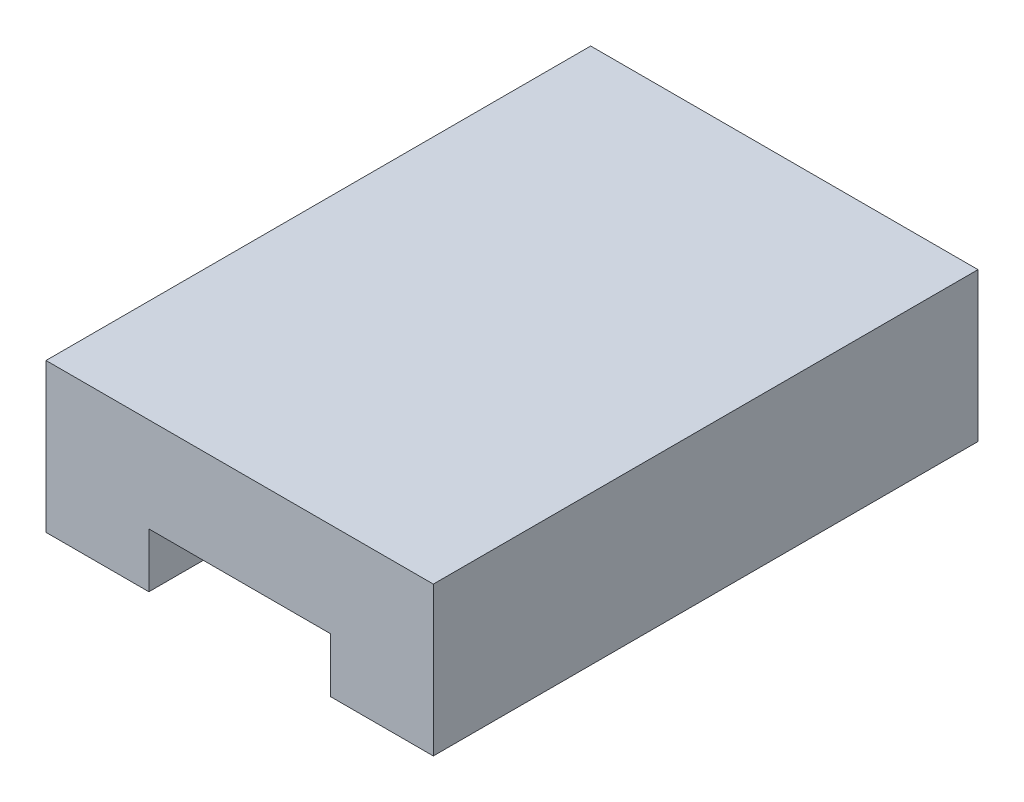
ISO-10303-21;
HEADER;
FILE_DESCRIPTION(('STEP AP214'),'2;1');
FILE_NAME('part.step','',(''),(''),'','','');
FILE_SCHEMA(('AUTOMOTIVE_DESIGN { 1 0 10303 214 1 1 1 1 }'));
ENDSEC;
DATA;
#1=APPLICATION_CONTEXT('core data for automotive mechanical design processes');
#2=APPLICATION_PROTOCOL_DEFINITION('international standard','automotive_design',2000,#1);
#3=PRODUCT_CONTEXT('',#1,'mechanical');
#4=PRODUCT('Part','Part','',(#3));
#5=PRODUCT_RELATED_PRODUCT_CATEGORY('part','',(#4));
#6=PRODUCT_DEFINITION_FORMATION('','',#4);
#7=PRODUCT_DEFINITION_CONTEXT('part definition',#1,'design');
#8=PRODUCT_DEFINITION('design','',#6,#7);
#9=PRODUCT_DEFINITION_SHAPE('','',#8);
#10=(LENGTH_UNIT() NAMED_UNIT(*) SI_UNIT(.MILLI.,.METRE.));
#11=(NAMED_UNIT(*) PLANE_ANGLE_UNIT() SI_UNIT($,.RADIAN.));
#12=(NAMED_UNIT(*) SI_UNIT($,.STERADIAN.) SOLID_ANGLE_UNIT());
#13=UNCERTAINTY_MEASURE_WITH_UNIT(LENGTH_MEASURE(1.E-05),#10,'distance_accuracy_value','');
#14=(GEOMETRIC_REPRESENTATION_CONTEXT(3) GLOBAL_UNCERTAINTY_ASSIGNED_CONTEXT((#13)) GLOBAL_UNIT_ASSIGNED_CONTEXT((#10,
#11,#12)) REPRESENTATION_CONTEXT('',''));
#15=CARTESIAN_POINT('',(0.,0.,0.));
#16=DIRECTION('',(0.,0.,1.));
#17=DIRECTION('',(1.,0.,0.));
#18=AXIS2_PLACEMENT_3D('',#15,#16,#17);
#19=CARTESIAN_POINT('',(0.,4.5,45.));
#20=DIRECTION('',(0.,1.,0.));
#21=DIRECTION('',(-1.,0.,0.));
#22=AXIS2_PLACEMENT_3D('',#19,#20,#21);
#23=PLANE('',#22);
#24=DIRECTION('',(1.,0.,0.));
#25=VECTOR('',#24,1.);
#26=CARTESIAN_POINT('',(0.,4.5,0.));
#27=LINE('',#26,#25);
#28=CARTESIAN_POINT('',(8.5,4.5,0.));
#29=VERTEX_POINT('',#28);
#30=CARTESIAN_POINT('',(23.5,4.5,0.));
#31=VERTEX_POINT('',#30);
#32=EDGE_CURVE('E135',#29,#31,#27,.T.);
#33=ORIENTED_EDGE('',*,*,#32,.T.);
#34=DIRECTION('',(0.,0.,-1.));
#35=VECTOR('',#34,1.);
#36=CARTESIAN_POINT('',(23.5,4.5,45.));
#37=LINE('',#36,#35);
#38=CARTESIAN_POINT('',(23.5,4.5,45.));
#39=VERTEX_POINT('',#38);
#40=EDGE_CURVE('E11',#39,#31,#37,.T.);
#41=ORIENTED_EDGE('',*,*,#40,.F.);
#42=DIRECTION('',(1.,0.,0.));
#43=VECTOR('',#42,1.);
#44=CARTESIAN_POINT('',(0.,4.5,45.));
#45=LINE('',#44,#43);
#46=CARTESIAN_POINT('',(8.5,4.5,45.));
#47=VERTEX_POINT('',#46);
#48=EDGE_CURVE('E150',#47,#39,#45,.T.);
#49=ORIENTED_EDGE('',*,*,#48,.F.);
#50=DIRECTION('',(0.,0.,-1.));
#51=VECTOR('',#50,1.);
#52=CARTESIAN_POINT('',(8.5,4.5,45.));
#53=LINE('',#52,#51);
#54=EDGE_CURVE('E134',#47,#29,#53,.T.);
#55=ORIENTED_EDGE('',*,*,#54,.T.);
#56=EDGE_LOOP('',(#33,#41,#49,#55));
#57=FACE_BOUND('',#56,.T.);
#58=ADVANCED_FACE('F37',(#57),#23,.F.);
#59=CARTESIAN_POINT('',(23.5,0.,45.));
#60=DIRECTION('',(1.,0.,0.));
#61=DIRECTION('',(0.,0.,-1.));
#62=AXIS2_PLACEMENT_3D('',#59,#60,#61);
#63=PLANE('',#62);
#64=DIRECTION('',(0.,-1.,0.));
#65=VECTOR('',#64,1.);
#66=CARTESIAN_POINT('',(23.5,0.,0.));
#67=LINE('',#66,#65);
#68=CARTESIAN_POINT('',(23.5,0.,0.));
#69=VERTEX_POINT('',#68);
#70=EDGE_CURVE('E138',#31,#69,#67,.T.);
#71=ORIENTED_EDGE('',*,*,#70,.T.);
#72=DIRECTION('',(0.,0.,-1.));
#73=VECTOR('',#72,1.);
#74=CARTESIAN_POINT('',(23.5,0.,45.));
#75=LINE('',#74,#73);
#76=CARTESIAN_POINT('',(23.5,0.,45.));
#77=VERTEX_POINT('',#76);
#78=EDGE_CURVE('E45',#77,#69,#75,.T.);
#79=ORIENTED_EDGE('',*,*,#78,.F.);
#80=DIRECTION('',(0.,-1.,0.));
#81=VECTOR('',#80,1.);
#82=CARTESIAN_POINT('',(23.5,0.,45.));
#83=LINE('',#82,#81);
#84=EDGE_CURVE('E95',#39,#77,#83,.T.);
#85=ORIENTED_EDGE('',*,*,#84,.F.);
#86=ORIENTED_EDGE('',*,*,#40,.T.);
#87=EDGE_LOOP('',(#71,#79,#85,#86));
#88=FACE_BOUND('',#87,.T.);
#89=ADVANCED_FACE('F178',(#88),#63,.F.);
#90=CARTESIAN_POINT('',(0.,0.,45.));
#91=DIRECTION('',(0.,1.,0.));
#92=DIRECTION('',(0.,0.,1.));
#93=AXIS2_PLACEMENT_3D('',#90,#91,#92);
#94=PLANE('',#93);
#95=DIRECTION('',(1.,0.,0.));
#96=VECTOR('',#95,1.);
#97=CARTESIAN_POINT('',(0.,0.,0.));
#98=LINE('',#97,#96);
#99=CARTESIAN_POINT('',(32.,0.,0.));
#100=VERTEX_POINT('',#99);
#101=EDGE_CURVE('E140',#69,#100,#98,.T.);
#102=ORIENTED_EDGE('',*,*,#101,.T.);
#103=DIRECTION('',(0.,0.,-1.));
#104=VECTOR('',#103,1.);
#105=CARTESIAN_POINT('',(32.,0.,45.));
#106=LINE('',#105,#104);
#107=CARTESIAN_POINT('',(32.,0.,45.));
#108=VERTEX_POINT('',#107);
#109=EDGE_CURVE('E156',#108,#100,#106,.T.);
#110=ORIENTED_EDGE('',*,*,#109,.F.);
#111=DIRECTION('',(1.,0.,0.));
#112=VECTOR('',#111,1.);
#113=CARTESIAN_POINT('',(0.,0.,45.));
#114=LINE('',#113,#112);
#115=EDGE_CURVE('E123',#77,#108,#114,.T.);
#116=ORIENTED_EDGE('',*,*,#115,.F.);
#117=ORIENTED_EDGE('',*,*,#78,.T.);
#118=EDGE_LOOP('',(#102,#110,#116,#117));
#119=FACE_BOUND('',#118,.T.);
#120=ADVANCED_FACE('F162',(#119),#94,.F.);
#121=CARTESIAN_POINT('',(32.,0.,45.));
#122=DIRECTION('',(-1.,0.,0.));
#123=DIRECTION('',(0.,-1.,0.));
#124=AXIS2_PLACEMENT_3D('',#121,#122,#123);
#125=PLANE('',#124);
#126=DIRECTION('',(0.,1.,0.));
#127=VECTOR('',#126,1.);
#128=CARTESIAN_POINT('',(32.,0.,0.));
#129=LINE('',#128,#127);
#130=CARTESIAN_POINT('',(32.,12.3,0.));
#131=VERTEX_POINT('',#130);
#132=EDGE_CURVE('E142',#100,#131,#129,.T.);
#133=ORIENTED_EDGE('',*,*,#132,.T.);
#134=DIRECTION('',(0.,0.,-1.));
#135=VECTOR('',#134,1.);
#136=CARTESIAN_POINT('',(32.,12.3,45.));
#137=LINE('',#136,#135);
#138=CARTESIAN_POINT('',(32.,12.3,45.));
#139=VERTEX_POINT('',#138);
#140=EDGE_CURVE('E154',#139,#131,#137,.T.);
#141=ORIENTED_EDGE('',*,*,#140,.F.);
#142=DIRECTION('',(0.,1.,0.));
#143=VECTOR('',#142,1.);
#144=CARTESIAN_POINT('',(32.,0.,45.));
#145=LINE('',#144,#143);
#146=EDGE_CURVE('E129',#108,#139,#145,.T.);
#147=ORIENTED_EDGE('',*,*,#146,.F.);
#148=ORIENTED_EDGE('',*,*,#109,.T.);
#149=EDGE_LOOP('',(#133,#141,#147,#148));
#150=FACE_BOUND('',#149,.T.);
#151=ADVANCED_FACE('F171',(#150),#125,.F.);
#152=CARTESIAN_POINT('',(0.,12.3,45.));
#153=DIRECTION('',(0.,1.,0.));
#154=DIRECTION('',(0.,0.,1.));
#155=AXIS2_PLACEMENT_3D('',#152,#153,#154);
#156=PLANE('',#155);
#157=DIRECTION('',(1.,0.,0.));
#158=VECTOR('',#157,1.);
#159=CARTESIAN_POINT('',(0.,12.3,0.));
#160=LINE('',#159,#158);
#161=CARTESIAN_POINT('',(0.,12.3,0.));
#162=VERTEX_POINT('',#161);
#163=EDGE_CURVE('E145',#162,#131,#160,.T.);
#164=ORIENTED_EDGE('',*,*,#163,.F.);
#165=DIRECTION('',(0.,0.,-1.));
#166=VECTOR('',#165,1.);
#167=CARTESIAN_POINT('',(0.,12.3,45.));
#168=LINE('',#167,#166);
#169=CARTESIAN_POINT('',(0.,12.3,45.));
#170=VERTEX_POINT('',#169);
#171=EDGE_CURVE('E117',#170,#162,#168,.T.);
#172=ORIENTED_EDGE('',*,*,#171,.F.);
#173=DIRECTION('',(1.,0.,0.));
#174=VECTOR('',#173,1.);
#175=CARTESIAN_POINT('',(0.,12.3,45.));
#176=LINE('',#175,#174);
#177=EDGE_CURVE('E127',#170,#139,#176,.T.);
#178=ORIENTED_EDGE('',*,*,#177,.T.);
#179=ORIENTED_EDGE('',*,*,#140,.T.);
#180=EDGE_LOOP('',(#164,#172,#178,#179));
#181=FACE_BOUND('',#180,.T.);
#182=ADVANCED_FACE('F188',(#181),#156,.T.);
#183=CARTESIAN_POINT('',(0.,0.,45.));
#184=DIRECTION('',(-1.,0.,0.));
#185=DIRECTION('',(0.,0.,1.));
#186=AXIS2_PLACEMENT_3D('',#183,#184,#185);
#187=PLANE('',#186);
#188=DIRECTION('',(0.,1.,0.));
#189=VECTOR('',#188,1.);
#190=CARTESIAN_POINT('',(0.,0.,0.));
#191=LINE('',#190,#189);
#192=CARTESIAN_POINT('',(0.,0.,0.));
#193=VERTEX_POINT('',#192);
#194=EDGE_CURVE('E116',#193,#162,#191,.T.);
#195=ORIENTED_EDGE('',*,*,#194,.F.);
#196=DIRECTION('',(0.,0.,-1.));
#197=VECTOR('',#196,1.);
#198=CARTESIAN_POINT('',(0.,0.,45.));
#199=LINE('',#198,#197);
#200=CARTESIAN_POINT('',(0.,0.,45.));
#201=VERTEX_POINT('',#200);
#202=EDGE_CURVE('E110',#201,#193,#199,.T.);
#203=ORIENTED_EDGE('',*,*,#202,.F.);
#204=DIRECTION('',(0.,1.,0.));
#205=VECTOR('',#204,1.);
#206=CARTESIAN_POINT('',(0.,0.,45.));
#207=LINE('',#206,#205);
#208=EDGE_CURVE('E114',#201,#170,#207,.T.);
#209=ORIENTED_EDGE('',*,*,#208,.T.);
#210=ORIENTED_EDGE('',*,*,#171,.T.);
#211=EDGE_LOOP('',(#195,#203,#209,#210));
#212=FACE_BOUND('',#211,.T.);
#213=ADVANCED_FACE('F112',(#212),#187,.T.);
#214=CARTESIAN_POINT('',(8.5,0.,0.));
#215=VERTEX_POINT('',#214);
#216=EDGE_CURVE('E81',#193,#215,#98,.T.);
#217=ORIENTED_EDGE('',*,*,#216,.T.);
#218=DIRECTION('',(0.,0.,-1.));
#219=VECTOR('',#218,1.);
#220=CARTESIAN_POINT('',(8.5,0.,45.));
#221=LINE('',#220,#219);
#222=CARTESIAN_POINT('',(8.5,0.,45.));
#223=VERTEX_POINT('',#222);
#224=EDGE_CURVE('E118',#223,#215,#221,.T.);
#225=ORIENTED_EDGE('',*,*,#224,.F.);
#226=EDGE_CURVE('E120',#201,#223,#114,.T.);
#227=ORIENTED_EDGE('',*,*,#226,.F.);
#228=ORIENTED_EDGE('',*,*,#202,.T.);
#229=EDGE_LOOP('',(#217,#225,#227,#228));
#230=FACE_BOUND('',#229,.T.);
#231=ADVANCED_FACE('F121',(#230),#94,.F.);
#232=CARTESIAN_POINT('',(8.5,0.,45.));
#233=DIRECTION('',(-1.,0.,0.));
#234=DIRECTION('',(0.,0.,1.));
#235=AXIS2_PLACEMENT_3D('',#232,#233,#234);
#236=PLANE('',#235);
#237=DIRECTION('',(0.,1.,0.));
#238=VECTOR('',#237,1.);
#239=CARTESIAN_POINT('',(8.5,0.,0.));
#240=LINE('',#239,#238);
#241=EDGE_CURVE('E87',#215,#29,#240,.T.);
#242=ORIENTED_EDGE('',*,*,#241,.T.);
#243=ORIENTED_EDGE('',*,*,#54,.F.);
#244=DIRECTION('',(0.,1.,0.));
#245=VECTOR('',#244,1.);
#246=CARTESIAN_POINT('',(8.5,0.,45.));
#247=LINE('',#246,#245);
#248=EDGE_CURVE('E53',#223,#47,#247,.T.);
#249=ORIENTED_EDGE('',*,*,#248,.F.);
#250=ORIENTED_EDGE('',*,*,#224,.T.);
#251=EDGE_LOOP('',(#242,#243,#249,#250));
#252=FACE_BOUND('',#251,.T.);
#253=ADVANCED_FACE('F195',(#252),#236,.F.);
#254=CARTESIAN_POINT('',(0.,0.,45.));
#255=DIRECTION('',(0.,0.,1.));
#256=DIRECTION('',(1.,0.,0.));
#257=AXIS2_PLACEMENT_3D('',#254,#255,#256);
#258=PLANE('',#257);
#259=ORIENTED_EDGE('',*,*,#48,.T.);
#260=ORIENTED_EDGE('',*,*,#84,.T.);
#261=ORIENTED_EDGE('',*,*,#115,.T.);
#262=ORIENTED_EDGE('',*,*,#146,.T.);
#263=ORIENTED_EDGE('',*,*,#177,.F.);
#264=ORIENTED_EDGE('',*,*,#208,.F.);
#265=ORIENTED_EDGE('',*,*,#226,.T.);
#266=ORIENTED_EDGE('',*,*,#248,.T.);
#267=EDGE_LOOP('',(#259,#260,#261,#262,#263,#264,#265,#266));
#268=FACE_BOUND('',#267,.T.);
#269=ADVANCED_FACE('F125',(#268),#258,.T.);
#270=CARTESIAN_POINT('',(0.,0.,0.));
#271=DIRECTION('',(0.,0.,1.));
#272=DIRECTION('',(1.,0.,0.));
#273=AXIS2_PLACEMENT_3D('',#270,#271,#272);
#274=PLANE('',#273);
#275=ORIENTED_EDGE('',*,*,#32,.F.);
#276=ORIENTED_EDGE('',*,*,#241,.F.);
#277=ORIENTED_EDGE('',*,*,#216,.F.);
#278=ORIENTED_EDGE('',*,*,#194,.T.);
#279=ORIENTED_EDGE('',*,*,#163,.T.);
#280=ORIENTED_EDGE('',*,*,#132,.F.);
#281=ORIENTED_EDGE('',*,*,#101,.F.);
#282=ORIENTED_EDGE('',*,*,#70,.F.);
#283=EDGE_LOOP('',(#275,#276,#277,#278,#279,#280,#281,#282));
#284=FACE_BOUND('',#283,.T.);
#285=ADVANCED_FACE('F167',(#284),#274,.F.);
#286=CLOSED_SHELL('',(#58,#89,#120,#151,#182,#213,#231,#253,#269,#285));
#287=MANIFOLD_SOLID_BREP('B2',#286);
#288=ADVANCED_BREP_SHAPE_REPRESENTATION('',(#18,#287),#14);
#289=SHAPE_DEFINITION_REPRESENTATION(#9,#288);
ENDSEC;
END-ISO-10303-21;
